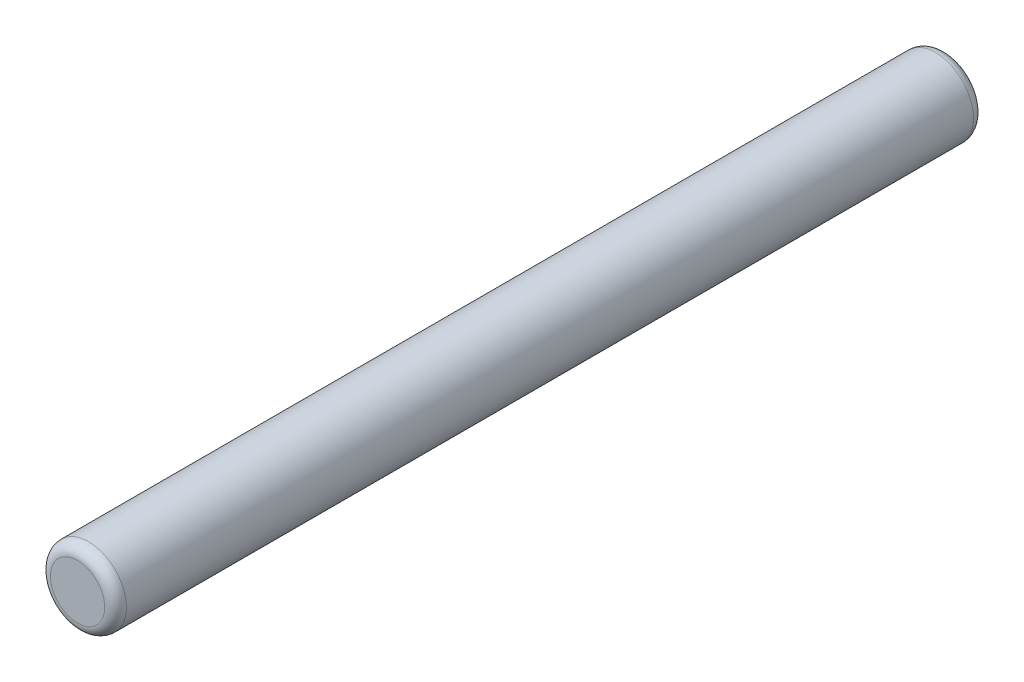
ISO-10303-21;
HEADER;
FILE_DESCRIPTION(('STEP AP214'),'2;1');
FILE_NAME('part.step','',(''),(''),'','','');
FILE_SCHEMA(('AUTOMOTIVE_DESIGN { 1 0 10303 214 1 1 1 1 }'));
ENDSEC;
DATA;
#1=APPLICATION_CONTEXT('core data for automotive mechanical design processes');
#2=APPLICATION_PROTOCOL_DEFINITION('international standard','automotive_design',2000,#1);
#3=PRODUCT_CONTEXT('',#1,'mechanical');
#4=PRODUCT('Part','Part','',(#3));
#5=PRODUCT_RELATED_PRODUCT_CATEGORY('part','',(#4));
#6=PRODUCT_DEFINITION_FORMATION('','',#4);
#7=PRODUCT_DEFINITION_CONTEXT('part definition',#1,'design');
#8=PRODUCT_DEFINITION('design','',#6,#7);
#9=PRODUCT_DEFINITION_SHAPE('','',#8);
#10=(LENGTH_UNIT() NAMED_UNIT(*) SI_UNIT(.MILLI.,.METRE.));
#11=(NAMED_UNIT(*) PLANE_ANGLE_UNIT() SI_UNIT($,.RADIAN.));
#12=(NAMED_UNIT(*) SI_UNIT($,.STERADIAN.) SOLID_ANGLE_UNIT());
#13=UNCERTAINTY_MEASURE_WITH_UNIT(LENGTH_MEASURE(1.E-05),#10,'distance_accuracy_value','');
#14=(GEOMETRIC_REPRESENTATION_CONTEXT(3) GLOBAL_UNCERTAINTY_ASSIGNED_CONTEXT((#13)) GLOBAL_UNIT_ASSIGNED_CONTEXT((#10,
#11,#12)) REPRESENTATION_CONTEXT('',''));
#15=CARTESIAN_POINT('',(0.,0.,0.));
#16=DIRECTION('',(0.,0.,1.));
#17=DIRECTION('',(1.,0.,0.));
#18=AXIS2_PLACEMENT_3D('',#15,#16,#17);
#19=CARTESIAN_POINT('',(0.,0.,20.));
#20=DIRECTION('',(0.,0.,-1.));
#21=DIRECTION('',(-1.,0.,0.));
#22=AXIS2_PLACEMENT_3D('',#19,#20,#21);
#23=CYLINDRICAL_SURFACE('',#22,0.875);
#24=CARTESIAN_POINT('',(0.,0.,0.25));
#25=DIRECTION('',(0.,0.,1.));
#26=DIRECTION('',(1.,0.,0.));
#27=AXIS2_PLACEMENT_3D('',#24,#25,#26);
#28=CIRCLE('',#27,0.875);
#29=CARTESIAN_POINT('',(0.875,0.,0.25));
#30=VERTEX_POINT('',#29);
#31=EDGE_CURVE('E43',#30,#30,#28,.T.);
#32=ORIENTED_EDGE('',*,*,#31,.T.);
#33=EDGE_LOOP('',(#32));
#34=FACE_BOUND('',#33,.T.);
#35=CARTESIAN_POINT('',(0.,0.,19.75));
#36=DIRECTION('',(0.,0.,1.));
#37=DIRECTION('',(1.,0.,0.));
#38=AXIS2_PLACEMENT_3D('',#35,#36,#37);
#39=CIRCLE('',#38,0.875);
#40=CARTESIAN_POINT('',(0.875,0.,19.75));
#41=VERTEX_POINT('',#40);
#42=EDGE_CURVE('E47',#41,#41,#39,.F.);
#43=ORIENTED_EDGE('',*,*,#42,.T.);
#44=EDGE_LOOP('',(#43));
#45=FACE_BOUND('',#44,.T.);
#46=ADVANCED_FACE('F32',(#34,#45),#23,.T.);
#47=CARTESIAN_POINT('',(0.,0.,20.));
#48=DIRECTION('',(0.,0.,1.));
#49=DIRECTION('',(1.,0.,0.));
#50=AXIS2_PLACEMENT_3D('',#47,#48,#49);
#51=PLANE('',#50);
#52=CARTESIAN_POINT('',(0.,0.,20.));
#53=DIRECTION('',(0.,0.,1.));
#54=DIRECTION('',(1.,0.,0.));
#55=AXIS2_PLACEMENT_3D('',#52,#53,#54);
#56=CIRCLE('',#55,0.625);
#57=CARTESIAN_POINT('',(0.625,0.,20.));
#58=VERTEX_POINT('',#57);
#59=EDGE_CURVE('E10',#58,#58,#56,.T.);
#60=ORIENTED_EDGE('',*,*,#59,.T.);
#61=EDGE_LOOP('',(#60));
#62=FACE_BOUND('',#61,.T.);
#63=ADVANCED_FACE('F63',(#62),#51,.T.);
#64=CARTESIAN_POINT('',(0.,0.,0.));
#65=DIRECTION('',(0.,0.,1.));
#66=DIRECTION('',(1.,0.,0.));
#67=AXIS2_PLACEMENT_3D('',#64,#65,#66);
#68=PLANE('',#67);
#69=CARTESIAN_POINT('',(0.,0.,0.));
#70=DIRECTION('',(0.,0.,1.));
#71=DIRECTION('',(1.,0.,0.));
#72=AXIS2_PLACEMENT_3D('',#69,#70,#71);
#73=CIRCLE('',#72,0.625);
#74=CARTESIAN_POINT('',(0.625,0.,0.));
#75=VERTEX_POINT('',#74);
#76=EDGE_CURVE('E39',#75,#75,#73,.F.);
#77=ORIENTED_EDGE('',*,*,#76,.T.);
#78=EDGE_LOOP('',(#77));
#79=FACE_BOUND('',#78,.T.);
#80=ADVANCED_FACE('F60',(#79),#68,.F.);
#81=CARTESIAN_POINT('',(0.,0.,0.25));
#82=DIRECTION('',(0.,0.,1.));
#83=DIRECTION('',(1.,0.,0.));
#84=AXIS2_PLACEMENT_3D('',#81,#82,#83);
#85=TOROIDAL_SURFACE('',#84,0.625,0.25);
#86=ORIENTED_EDGE('',*,*,#76,.F.);
#87=EDGE_LOOP('',(#86));
#88=FACE_BOUND('',#87,.T.);
#89=ORIENTED_EDGE('',*,*,#31,.F.);
#90=EDGE_LOOP('',(#89));
#91=FACE_BOUND('',#90,.T.);
#92=ADVANCED_FACE('F56',(#88,#91),#85,.T.);
#93=CARTESIAN_POINT('',(0.,0.,19.75));
#94=DIRECTION('',(0.,0.,1.));
#95=DIRECTION('',(1.,0.,0.));
#96=AXIS2_PLACEMENT_3D('',#93,#94,#95);
#97=TOROIDAL_SURFACE('',#96,0.625,0.25);
#98=ORIENTED_EDGE('',*,*,#42,.F.);
#99=EDGE_LOOP('',(#98));
#100=FACE_BOUND('',#99,.T.);
#101=ORIENTED_EDGE('',*,*,#59,.F.);
#102=EDGE_LOOP('',(#101));
#103=FACE_BOUND('',#102,.T.);
#104=ADVANCED_FACE('F34',(#100,#103),#97,.T.);
#105=CLOSED_SHELL('',(#46,#63,#80,#92,#104));
#106=MANIFOLD_SOLID_BREP('B2',#105);
#107=ADVANCED_BREP_SHAPE_REPRESENTATION('',(#18,#106),#14);
#108=SHAPE_DEFINITION_REPRESENTATION(#9,#107);
ENDSEC;
END-ISO-10303-21;
